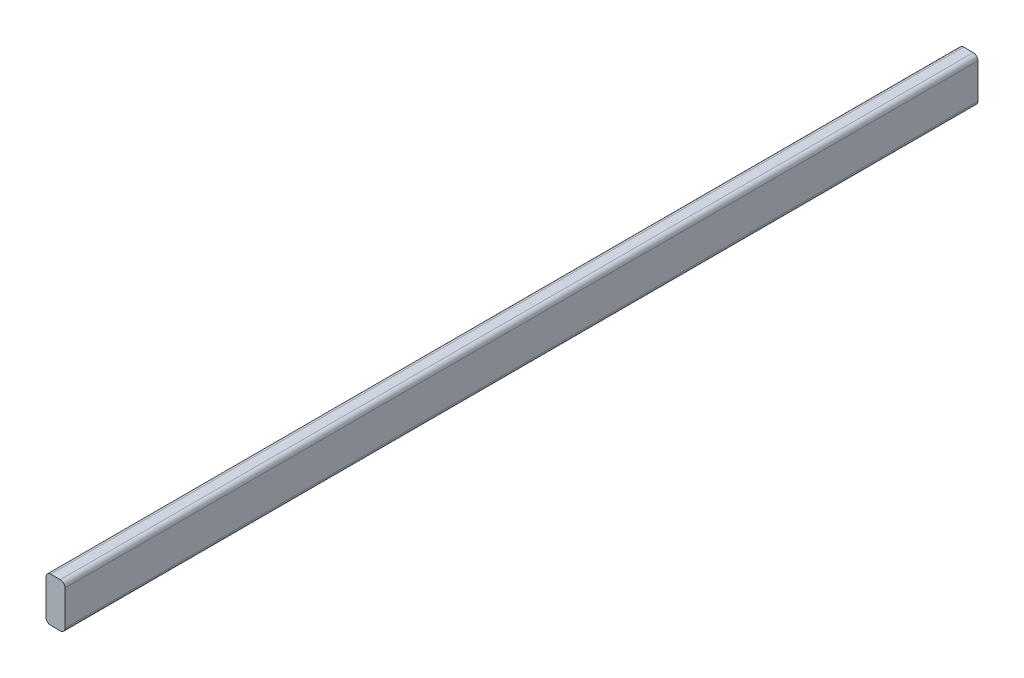
ISO-10303-21;
HEADER;
FILE_DESCRIPTION(('STEP AP214'),'2;1');
FILE_NAME('part.step','',(''),(''),'','','');
FILE_SCHEMA(('AUTOMOTIVE_DESIGN { 1 0 10303 214 1 1 1 1 }'));
ENDSEC;
DATA;
#1=APPLICATION_CONTEXT('core data for automotive mechanical design processes');
#2=APPLICATION_PROTOCOL_DEFINITION('international standard','automotive_design',2000,#1);
#3=PRODUCT_CONTEXT('',#1,'mechanical');
#4=PRODUCT('Part','Part','',(#3));
#5=PRODUCT_RELATED_PRODUCT_CATEGORY('part','',(#4));
#6=PRODUCT_DEFINITION_FORMATION('','',#4);
#7=PRODUCT_DEFINITION_CONTEXT('part definition',#1,'design');
#8=PRODUCT_DEFINITION('design','',#6,#7);
#9=PRODUCT_DEFINITION_SHAPE('','',#8);
#10=(LENGTH_UNIT() NAMED_UNIT(*) SI_UNIT(.MILLI.,.METRE.));
#11=(NAMED_UNIT(*) PLANE_ANGLE_UNIT() SI_UNIT($,.RADIAN.));
#12=(NAMED_UNIT(*) SI_UNIT($,.STERADIAN.) SOLID_ANGLE_UNIT());
#13=UNCERTAINTY_MEASURE_WITH_UNIT(LENGTH_MEASURE(1.E-05),#10,'distance_accuracy_value','');
#14=(GEOMETRIC_REPRESENTATION_CONTEXT(3) GLOBAL_UNCERTAINTY_ASSIGNED_CONTEXT((#13)) GLOBAL_UNIT_ASSIGNED_CONTEXT((#10,
#11,#12)) REPRESENTATION_CONTEXT('',''));
#15=CARTESIAN_POINT('',(0.,0.,0.));
#16=DIRECTION('',(0.,0.,1.));
#17=DIRECTION('',(1.,0.,0.));
#18=AXIS2_PLACEMENT_3D('',#15,#16,#17);
#19=CARTESIAN_POINT('',(9.525,-22.225,457.2));
#20=DIRECTION('',(-1.,0.,0.));
#21=DIRECTION('',(0.,0.,1.));
#22=AXIS2_PLACEMENT_3D('',#19,#20,#21);
#23=PLANE('',#22);
#24=DIRECTION('',(0.,1.,0.));
#25=VECTOR('',#24,1.);
#26=CARTESIAN_POINT('',(9.525,-22.225,457.2));
#27=LINE('',#26,#25);
#28=CARTESIAN_POINT('',(9.525,-17.4625,457.2));
#29=VERTEX_POINT('',#28);
#30=CARTESIAN_POINT('',(9.525,17.4625,457.2));
#31=VERTEX_POINT('',#30);
#32=EDGE_CURVE('E124',#29,#31,#27,.T.);
#33=ORIENTED_EDGE('',*,*,#32,.F.);
#34=DIRECTION('',(0.,0.,-1.));
#35=VECTOR('',#34,1.);
#36=CARTESIAN_POINT('',(9.525,-17.4625,457.2));
#37=LINE('',#36,#35);
#38=CARTESIAN_POINT('',(9.525,-17.4625,-457.2));
#39=VERTEX_POINT('',#38);
#40=EDGE_CURVE('E108',#29,#39,#37,.T.);
#41=ORIENTED_EDGE('',*,*,#40,.T.);
#42=DIRECTION('',(0.,1.,0.));
#43=VECTOR('',#42,1.);
#44=CARTESIAN_POINT('',(9.525,-22.225,-457.2));
#45=LINE('',#44,#43);
#46=CARTESIAN_POINT('',(9.525,17.4625,-457.2));
#47=VERTEX_POINT('',#46);
#48=EDGE_CURVE('E119',#39,#47,#45,.T.);
#49=ORIENTED_EDGE('',*,*,#48,.T.);
#50=DIRECTION('',(0.,0.,-1.));
#51=VECTOR('',#50,1.);
#52=CARTESIAN_POINT('',(9.525,17.4625,457.2));
#53=LINE('',#52,#51);
#54=EDGE_CURVE('E123',#47,#31,#53,.F.);
#55=ORIENTED_EDGE('',*,*,#54,.T.);
#56=EDGE_LOOP('',(#33,#41,#49,#55));
#57=FACE_BOUND('',#56,.T.);
#58=ADVANCED_FACE('F40',(#57),#23,.F.);
#59=CARTESIAN_POINT('',(-9.525,22.225,457.2));
#60=DIRECTION('',(0.,-1.,0.));
#61=DIRECTION('',(0.,0.,-1.));
#62=AXIS2_PLACEMENT_3D('',#59,#60,#61);
#63=PLANE('',#62);
#64=DIRECTION('',(-1.,0.,0.));
#65=VECTOR('',#64,1.);
#66=CARTESIAN_POINT('',(-9.525,22.225,457.2));
#67=LINE('',#66,#65);
#68=CARTESIAN_POINT('',(4.7625,22.225,457.2));
#69=VERTEX_POINT('',#68);
#70=CARTESIAN_POINT('',(-4.7625,22.225,457.2));
#71=VERTEX_POINT('',#70);
#72=EDGE_CURVE('E139',#69,#71,#67,.T.);
#73=ORIENTED_EDGE('',*,*,#72,.F.);
#74=DIRECTION('',(0.,0.,-1.));
#75=VECTOR('',#74,1.);
#76=CARTESIAN_POINT('',(4.7625,22.225,457.2));
#77=LINE('',#76,#75);
#78=CARTESIAN_POINT('',(4.7625,22.225,-457.2));
#79=VERTEX_POINT('',#78);
#80=EDGE_CURVE('E11',#69,#79,#77,.T.);
#81=ORIENTED_EDGE('',*,*,#80,.T.);
#82=DIRECTION('',(-1.,0.,0.));
#83=VECTOR('',#82,1.);
#84=CARTESIAN_POINT('',(-9.525,22.225,-457.2));
#85=LINE('',#84,#83);
#86=CARTESIAN_POINT('',(-4.7625,22.225,-457.2));
#87=VERTEX_POINT('',#86);
#88=EDGE_CURVE('E128',#79,#87,#85,.T.);
#89=ORIENTED_EDGE('',*,*,#88,.T.);
#90=DIRECTION('',(0.,0.,-1.));
#91=VECTOR('',#90,1.);
#92=CARTESIAN_POINT('',(-4.7625,22.225,457.2));
#93=LINE('',#92,#91);
#94=EDGE_CURVE('E44',#87,#71,#93,.F.);
#95=ORIENTED_EDGE('',*,*,#94,.T.);
#96=EDGE_LOOP('',(#73,#81,#89,#95));
#97=FACE_BOUND('',#96,.T.);
#98=ADVANCED_FACE('F170',(#97),#63,.F.);
#99=CARTESIAN_POINT('',(-9.52499999999999,-22.225,457.2));
#100=DIRECTION('',(1.,0.,0.));
#101=DIRECTION('',(0.,1.,0.));
#102=AXIS2_PLACEMENT_3D('',#99,#100,#101);
#103=PLANE('',#102);
#104=DIRECTION('',(0.,-1.,0.));
#105=VECTOR('',#104,1.);
#106=CARTESIAN_POINT('',(-9.52499999999999,-22.225,-457.2));
#107=LINE('',#106,#105);
#108=CARTESIAN_POINT('',(-9.525,17.4625,-457.2));
#109=VERTEX_POINT('',#108);
#110=CARTESIAN_POINT('',(-9.52499999999999,-17.4625,-457.2));
#111=VERTEX_POINT('',#110);
#112=EDGE_CURVE('E132',#109,#111,#107,.T.);
#113=ORIENTED_EDGE('',*,*,#112,.T.);
#114=DIRECTION('',(0.,0.,-1.));
#115=VECTOR('',#114,1.);
#116=CARTESIAN_POINT('',(-9.52499999999999,-17.4625,457.2));
#117=LINE('',#116,#115);
#118=CARTESIAN_POINT('',(-9.52499999999999,-17.4625,457.2));
#119=VERTEX_POINT('',#118);
#120=EDGE_CURVE('E55',#111,#119,#117,.F.);
#121=ORIENTED_EDGE('',*,*,#120,.T.);
#122=DIRECTION('',(0.,-1.,0.));
#123=VECTOR('',#122,1.);
#124=CARTESIAN_POINT('',(-9.52499999999999,-22.225,457.2));
#125=LINE('',#124,#123);
#126=CARTESIAN_POINT('',(-9.525,17.4625,457.2));
#127=VERTEX_POINT('',#126);
#128=EDGE_CURVE('E145',#127,#119,#125,.T.);
#129=ORIENTED_EDGE('',*,*,#128,.F.);
#130=DIRECTION('',(0.,0.,-1.));
#131=VECTOR('',#130,1.);
#132=CARTESIAN_POINT('',(-9.525,17.4625,457.2));
#133=LINE('',#132,#131);
#134=EDGE_CURVE('E163',#127,#109,#133,.T.);
#135=ORIENTED_EDGE('',*,*,#134,.T.);
#136=EDGE_LOOP('',(#113,#121,#129,#135));
#137=FACE_BOUND('',#136,.T.);
#138=ADVANCED_FACE('F172',(#137),#103,.F.);
#139=CARTESIAN_POINT('',(-9.52499999999999,-22.225,457.2));
#140=DIRECTION('',(0.,1.,0.));
#141=DIRECTION('',(-1.,0.,0.));
#142=AXIS2_PLACEMENT_3D('',#139,#140,#141);
#143=PLANE('',#142);
#144=DIRECTION('',(1.,0.,0.));
#145=VECTOR('',#144,1.);
#146=CARTESIAN_POINT('',(-9.52499999999999,-22.225,-457.2));
#147=LINE('',#146,#145);
#148=CARTESIAN_POINT('',(-4.76249999999999,-22.225,-457.2));
#149=VERTEX_POINT('',#148);
#150=CARTESIAN_POINT('',(4.7625,-22.225,-457.2));
#151=VERTEX_POINT('',#150);
#152=EDGE_CURVE('E140',#149,#151,#147,.T.);
#153=ORIENTED_EDGE('',*,*,#152,.T.);
#154=DIRECTION('',(0.,0.,-1.));
#155=VECTOR('',#154,1.);
#156=CARTESIAN_POINT('',(4.7625,-22.225,457.2));
#157=LINE('',#156,#155);
#158=CARTESIAN_POINT('',(4.7625,-22.225,457.2));
#159=VERTEX_POINT('',#158);
#160=EDGE_CURVE('E107',#151,#159,#157,.F.);
#161=ORIENTED_EDGE('',*,*,#160,.T.);
#162=DIRECTION('',(1.,0.,0.));
#163=VECTOR('',#162,1.);
#164=CARTESIAN_POINT('',(-9.52499999999999,-22.225,457.2));
#165=LINE('',#164,#163);
#166=CARTESIAN_POINT('',(-4.76249999999999,-22.225,457.2));
#167=VERTEX_POINT('',#166);
#168=EDGE_CURVE('E144',#167,#159,#165,.T.);
#169=ORIENTED_EDGE('',*,*,#168,.F.);
#170=DIRECTION('',(0.,0.,-1.));
#171=VECTOR('',#170,1.);
#172=CARTESIAN_POINT('',(-4.76249999999999,-22.225,457.2));
#173=LINE('',#172,#171);
#174=EDGE_CURVE('E112',#167,#149,#173,.T.);
#175=ORIENTED_EDGE('',*,*,#174,.T.);
#176=EDGE_LOOP('',(#153,#161,#169,#175));
#177=FACE_BOUND('',#176,.T.);
#178=ADVANCED_FACE('F181',(#177),#143,.F.);
#179=CARTESIAN_POINT('',(0.,0.,457.2));
#180=DIRECTION('',(0.,0.,-1.));
#181=DIRECTION('',(-1.,0.,0.));
#182=AXIS2_PLACEMENT_3D('',#179,#180,#181);
#183=PLANE('',#182);
#184=ORIENTED_EDGE('',*,*,#168,.T.);
#185=CARTESIAN_POINT('',(4.7625,-17.4625,457.2));
#186=DIRECTION('',(0.,0.,-1.));
#187=DIRECTION('',(-1.,0.,0.));
#188=AXIS2_PLACEMENT_3D('',#185,#186,#187);
#189=CIRCLE('',#188,4.7625);
#190=EDGE_CURVE('E159',#159,#29,#189,.F.);
#191=ORIENTED_EDGE('',*,*,#190,.T.);
#192=ORIENTED_EDGE('',*,*,#32,.T.);
#193=CARTESIAN_POINT('',(4.7625,17.4625,457.2));
#194=DIRECTION('',(0.,0.,-1.));
#195=DIRECTION('',(-1.,0.,0.));
#196=AXIS2_PLACEMENT_3D('',#193,#194,#195);
#197=CIRCLE('',#196,4.7625);
#198=EDGE_CURVE('E151',#31,#69,#197,.F.);
#199=ORIENTED_EDGE('',*,*,#198,.T.);
#200=ORIENTED_EDGE('',*,*,#72,.T.);
#201=CARTESIAN_POINT('',(-4.7625,17.4625,457.2));
#202=DIRECTION('',(0.,0.,-1.));
#203=DIRECTION('',(-1.,0.,0.));
#204=AXIS2_PLACEMENT_3D('',#201,#202,#203);
#205=CIRCLE('',#204,4.7625);
#206=EDGE_CURVE('E56',#71,#127,#205,.F.);
#207=ORIENTED_EDGE('',*,*,#206,.T.);
#208=ORIENTED_EDGE('',*,*,#128,.T.);
#209=CARTESIAN_POINT('',(-4.76249999999999,-17.4625,457.2));
#210=DIRECTION('',(0.,0.,-1.));
#211=DIRECTION('',(-1.,0.,0.));
#212=AXIS2_PLACEMENT_3D('',#209,#210,#211);
#213=CIRCLE('',#212,4.7625);
#214=EDGE_CURVE('E160',#119,#167,#213,.F.);
#215=ORIENTED_EDGE('',*,*,#214,.T.);
#216=EDGE_LOOP('',(#184,#191,#192,#199,#200,#207,#208,#215));
#217=FACE_BOUND('',#216,.T.);
#218=ADVANCED_FACE('F167',(#217),#183,.F.);
#219=CARTESIAN_POINT('',(0.,0.,-457.2));
#220=DIRECTION('',(0.,0.,-1.));
#221=DIRECTION('',(-1.,0.,0.));
#222=AXIS2_PLACEMENT_3D('',#219,#220,#221);
#223=PLANE('',#222);
#224=ORIENTED_EDGE('',*,*,#48,.F.);
#225=CARTESIAN_POINT('',(4.7625,-17.4625,-457.2));
#226=DIRECTION('',(0.,0.,-1.));
#227=DIRECTION('',(-1.,0.,0.));
#228=AXIS2_PLACEMENT_3D('',#225,#226,#227);
#229=CIRCLE('',#228,4.7625);
#230=EDGE_CURVE('E104',#39,#151,#229,.T.);
#231=ORIENTED_EDGE('',*,*,#230,.T.);
#232=ORIENTED_EDGE('',*,*,#152,.F.);
#233=CARTESIAN_POINT('',(-4.76249999999999,-17.4625,-457.2));
#234=DIRECTION('',(0.,0.,-1.));
#235=DIRECTION('',(-1.,0.,0.));
#236=AXIS2_PLACEMENT_3D('',#233,#234,#235);
#237=CIRCLE('',#236,4.7625);
#238=EDGE_CURVE('E114',#149,#111,#237,.T.);
#239=ORIENTED_EDGE('',*,*,#238,.T.);
#240=ORIENTED_EDGE('',*,*,#112,.F.);
#241=CARTESIAN_POINT('',(-4.7625,17.4625,-457.2));
#242=DIRECTION('',(0.,0.,-1.));
#243=DIRECTION('',(-1.,0.,0.));
#244=AXIS2_PLACEMENT_3D('',#241,#242,#243);
#245=CIRCLE('',#244,4.7625);
#246=EDGE_CURVE('E121',#109,#87,#245,.T.);
#247=ORIENTED_EDGE('',*,*,#246,.T.);
#248=ORIENTED_EDGE('',*,*,#88,.F.);
#249=CARTESIAN_POINT('',(4.7625,17.4625,-457.2));
#250=DIRECTION('',(0.,0.,-1.));
#251=DIRECTION('',(-1.,0.,0.));
#252=AXIS2_PLACEMENT_3D('',#249,#250,#251);
#253=CIRCLE('',#252,4.7625);
#254=EDGE_CURVE('E126',#79,#47,#253,.T.);
#255=ORIENTED_EDGE('',*,*,#254,.T.);
#256=EDGE_LOOP('',(#224,#231,#232,#239,#240,#247,#248,#255));
#257=FACE_BOUND('',#256,.T.);
#258=ADVANCED_FACE('F130',(#257),#223,.T.);
#259=CARTESIAN_POINT('',(4.7625,-17.4625,457.2));
#260=DIRECTION('',(0.,0.,-1.));
#261=DIRECTION('',(-1.,0.,0.));
#262=AXIS2_PLACEMENT_3D('',#259,#260,#261);
#263=CYLINDRICAL_SURFACE('',#262,4.7625);
#264=ORIENTED_EDGE('',*,*,#190,.F.);
#265=ORIENTED_EDGE('',*,*,#160,.F.);
#266=ORIENTED_EDGE('',*,*,#230,.F.);
#267=ORIENTED_EDGE('',*,*,#40,.F.);
#268=EDGE_LOOP('',(#264,#265,#266,#267));
#269=FACE_BOUND('',#268,.T.);
#270=ADVANCED_FACE('F110',(#269),#263,.T.);
#271=CARTESIAN_POINT('',(-4.76249999999999,-17.4625,457.2));
#272=DIRECTION('',(0.,0.,-1.));
#273=DIRECTION('',(-1.,0.,0.));
#274=AXIS2_PLACEMENT_3D('',#271,#272,#273);
#275=CYLINDRICAL_SURFACE('',#274,4.7625);
#276=ORIENTED_EDGE('',*,*,#214,.F.);
#277=ORIENTED_EDGE('',*,*,#120,.F.);
#278=ORIENTED_EDGE('',*,*,#238,.F.);
#279=ORIENTED_EDGE('',*,*,#174,.F.);
#280=EDGE_LOOP('',(#276,#277,#278,#279));
#281=FACE_BOUND('',#280,.T.);
#282=ADVANCED_FACE('F178',(#281),#275,.T.);
#283=CARTESIAN_POINT('',(4.7625,17.4625,457.2));
#284=DIRECTION('',(0.,0.,-1.));
#285=DIRECTION('',(-1.,0.,0.));
#286=AXIS2_PLACEMENT_3D('',#283,#284,#285);
#287=CYLINDRICAL_SURFACE('',#286,4.7625);
#288=ORIENTED_EDGE('',*,*,#198,.F.);
#289=ORIENTED_EDGE('',*,*,#54,.F.);
#290=ORIENTED_EDGE('',*,*,#254,.F.);
#291=ORIENTED_EDGE('',*,*,#80,.F.);
#292=EDGE_LOOP('',(#288,#289,#290,#291));
#293=FACE_BOUND('',#292,.T.);
#294=ADVANCED_FACE('F182',(#293),#287,.T.);
#295=CARTESIAN_POINT('',(-4.7625,17.4625,457.2));
#296=DIRECTION('',(0.,0.,-1.));
#297=DIRECTION('',(-1.,0.,0.));
#298=AXIS2_PLACEMENT_3D('',#295,#296,#297);
#299=CYLINDRICAL_SURFACE('',#298,4.7625);
#300=ORIENTED_EDGE('',*,*,#206,.F.);
#301=ORIENTED_EDGE('',*,*,#94,.F.);
#302=ORIENTED_EDGE('',*,*,#246,.F.);
#303=ORIENTED_EDGE('',*,*,#134,.F.);
#304=EDGE_LOOP('',(#300,#301,#302,#303));
#305=FACE_BOUND('',#304,.T.);
#306=ADVANCED_FACE('F39',(#305),#299,.T.);
#307=CLOSED_SHELL('',(#58,#98,#138,#178,#218,#258,#270,#282,#294,#306));
#308=MANIFOLD_SOLID_BREP('B2',#307);
#309=ADVANCED_BREP_SHAPE_REPRESENTATION('',(#18,#308),#14);
#310=SHAPE_DEFINITION_REPRESENTATION(#9,#309);
ENDSEC;
END-ISO-10303-21;
